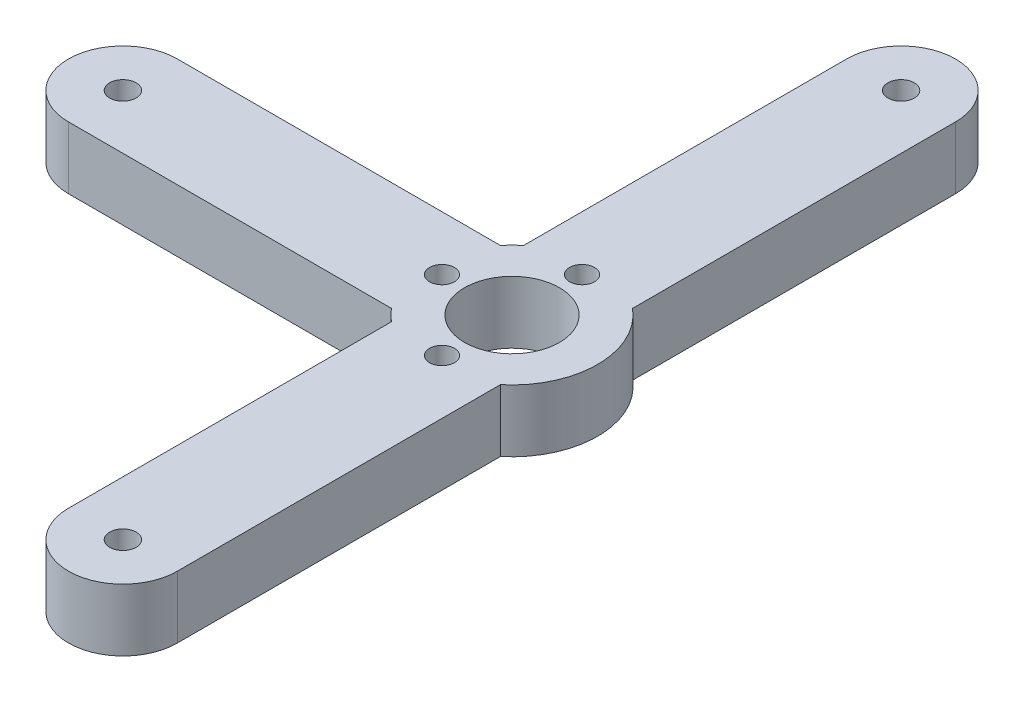
ISO-10303-21;
HEADER;
FILE_DESCRIPTION(('STEP AP214'),'2;1');
FILE_NAME('part.step','',(''),(''),'','','');
FILE_SCHEMA(('AUTOMOTIVE_DESIGN { 1 0 10303 214 1 1 1 1 }'));
ENDSEC;
DATA;
#1=APPLICATION_CONTEXT('core data for automotive mechanical design processes');
#2=APPLICATION_PROTOCOL_DEFINITION('international standard','automotive_design',2000,#1);
#3=PRODUCT_CONTEXT('',#1,'mechanical');
#4=PRODUCT('Part','Part','',(#3));
#5=PRODUCT_RELATED_PRODUCT_CATEGORY('part','',(#4));
#6=PRODUCT_DEFINITION_FORMATION('','',#4);
#7=PRODUCT_DEFINITION_CONTEXT('part definition',#1,'design');
#8=PRODUCT_DEFINITION('design','',#6,#7);
#9=PRODUCT_DEFINITION_SHAPE('','',#8);
#10=(LENGTH_UNIT() NAMED_UNIT(*) SI_UNIT(.MILLI.,.METRE.));
#11=(NAMED_UNIT(*) PLANE_ANGLE_UNIT() SI_UNIT($,.RADIAN.));
#12=(NAMED_UNIT(*) SI_UNIT($,.STERADIAN.) SOLID_ANGLE_UNIT());
#13=UNCERTAINTY_MEASURE_WITH_UNIT(LENGTH_MEASURE(1.E-05),#10,'distance_accuracy_value','');
#14=(GEOMETRIC_REPRESENTATION_CONTEXT(3) GLOBAL_UNCERTAINTY_ASSIGNED_CONTEXT((#13)) GLOBAL_UNIT_ASSIGNED_CONTEXT((#10,
#11,#12)) REPRESENTATION_CONTEXT('',''));
#15=CARTESIAN_POINT('',(0.,0.,0.));
#16=DIRECTION('',(0.,0.,1.));
#17=DIRECTION('',(1.,0.,0.));
#18=AXIS2_PLACEMENT_3D('',#15,#16,#17);
#19=CARTESIAN_POINT('',(-56.2916512459885,150.6,0.));
#20=DIRECTION('',(0.,-1.,0.));
#21=DIRECTION('',(0.,0.,-1.));
#22=AXIS2_PLACEMENT_3D('',#19,#20,#21);
#23=PLANE('',#22);
#24=CARTESIAN_POINT('',(-106.291651245989,150.6,0.));
#25=DIRECTION('',(0.,1.,0.));
#26=DIRECTION('',(0.,0.,1.));
#27=AXIS2_PLACEMENT_3D('',#24,#25,#26);
#28=CIRCLE('',#27,1.69999999999999);
#29=CARTESIAN_POINT('',(-106.291651245989,150.6,1.69999999999999));
#30=VERTEX_POINT('',#29);
#31=EDGE_CURVE('E201',#30,#30,#28,.T.);
#32=ORIENTED_EDGE('',*,*,#31,.T.);
#33=EDGE_LOOP('',(#32));
#34=FACE_BOUND('',#33,.T.);
#35=CARTESIAN_POINT('',(-106.291651245989,150.6,0.));
#36=DIRECTION('',(0.,1.,0.));
#37=DIRECTION('',(0.,0.,1.));
#38=AXIS2_PLACEMENT_3D('',#35,#36,#37);
#39=CIRCLE('',#38,3.10000000000001);
#40=CARTESIAN_POINT('',(-106.291651245989,150.6,3.10000000000001));
#41=VERTEX_POINT('',#40);
#42=EDGE_CURVE('E211',#41,#41,#39,.T.);
#43=ORIENTED_EDGE('',*,*,#42,.F.);
#44=EDGE_LOOP('',(#43));
#45=FACE_BOUND('',#44,.T.);
#46=ADVANCED_FACE('F44',(#34,#45),#23,.T.);
#47=CARTESIAN_POINT('',(-56.2916512459885,150.6,-50.));
#48=DIRECTION('',(0.,1.,0.));
#49=DIRECTION('',(0.,0.,1.));
#50=AXIS2_PLACEMENT_3D('',#47,#48,#49);
#51=CIRCLE('',#50,1.7);
#52=CARTESIAN_POINT('',(-56.2916512459885,150.6,-48.3));
#53=VERTEX_POINT('',#52);
#54=EDGE_CURVE('E199',#53,#53,#51,.T.);
#55=ORIENTED_EDGE('',*,*,#54,.T.);
#56=EDGE_LOOP('',(#55));
#57=FACE_BOUND('',#56,.T.);
#58=CARTESIAN_POINT('',(-56.2916512459885,150.6,-50.));
#59=DIRECTION('',(0.,1.,0.));
#60=DIRECTION('',(0.,0.,1.));
#61=AXIS2_PLACEMENT_3D('',#58,#59,#60);
#62=CIRCLE('',#61,3.1);
#63=CARTESIAN_POINT('',(-56.2916512459885,150.6,-46.9));
#64=VERTEX_POINT('',#63);
#65=EDGE_CURVE('E219',#64,#64,#62,.T.);
#66=ORIENTED_EDGE('',*,*,#65,.F.);
#67=EDGE_LOOP('',(#66));
#68=FACE_BOUND('',#67,.T.);
#69=ADVANCED_FACE('F331',(#57,#68),#23,.T.);
#70=CARTESIAN_POINT('',(-56.2916512459885,150.6,50.));
#71=DIRECTION('',(0.,1.,0.));
#72=DIRECTION('',(0.,0.,1.));
#73=AXIS2_PLACEMENT_3D('',#70,#71,#72);
#74=CIRCLE('',#73,1.7);
#75=CARTESIAN_POINT('',(-56.2916512459885,150.6,51.7));
#76=VERTEX_POINT('',#75);
#77=EDGE_CURVE('E197',#76,#76,#74,.T.);
#78=ORIENTED_EDGE('',*,*,#77,.T.);
#79=EDGE_LOOP('',(#78));
#80=FACE_BOUND('',#79,.T.);
#81=CARTESIAN_POINT('',(-56.2916512459885,150.6,50.));
#82=DIRECTION('',(0.,1.,0.));
#83=DIRECTION('',(0.,0.,1.));
#84=AXIS2_PLACEMENT_3D('',#81,#82,#83);
#85=CIRCLE('',#84,3.1);
#86=CARTESIAN_POINT('',(-56.2916512459885,150.6,53.1));
#87=VERTEX_POINT('',#86);
#88=EDGE_CURVE('E206',#87,#87,#85,.T.);
#89=ORIENTED_EDGE('',*,*,#88,.F.);
#90=EDGE_LOOP('',(#89));
#91=FACE_BOUND('',#90,.T.);
#92=ADVANCED_FACE('F336',(#80,#91),#23,.T.);
#93=CARTESIAN_POINT('',(-106.291651245989,153.,0.));
#94=DIRECTION('',(0.,-1.,0.));
#95=DIRECTION('',(0.,0.,-1.));
#96=AXIS2_PLACEMENT_3D('',#93,#94,#95);
#97=CYLINDRICAL_SURFACE('',#96,1.69999999999999);
#98=ORIENTED_EDGE('',*,*,#31,.F.);
#99=EDGE_LOOP('',(#98));
#100=FACE_BOUND('',#99,.T.);
#101=CARTESIAN_POINT('',(-106.291651245989,157.,0.));
#102=DIRECTION('',(0.,1.,0.));
#103=DIRECTION('',(0.,0.,1.));
#104=AXIS2_PLACEMENT_3D('',#101,#102,#103);
#105=CIRCLE('',#104,1.69999999999999);
#106=CARTESIAN_POINT('',(-106.291651245989,157.,1.69999999999999));
#107=VERTEX_POINT('',#106);
#108=EDGE_CURVE('E156',#107,#107,#105,.T.);
#109=ORIENTED_EDGE('',*,*,#108,.T.);
#110=EDGE_LOOP('',(#109));
#111=FACE_BOUND('',#110,.T.);
#112=ADVANCED_FACE('F350',(#100,#111),#97,.F.);
#113=CARTESIAN_POINT('',(-56.2916512459885,153.,-50.));
#114=DIRECTION('',(0.,-1.,0.));
#115=DIRECTION('',(0.,0.,-1.));
#116=AXIS2_PLACEMENT_3D('',#113,#114,#115);
#117=CYLINDRICAL_SURFACE('',#116,1.7);
#118=ORIENTED_EDGE('',*,*,#54,.F.);
#119=EDGE_LOOP('',(#118));
#120=FACE_BOUND('',#119,.T.);
#121=CARTESIAN_POINT('',(-56.2916512459885,157.,-50.));
#122=DIRECTION('',(0.,1.,0.));
#123=DIRECTION('',(0.,0.,1.));
#124=AXIS2_PLACEMENT_3D('',#121,#122,#123);
#125=CIRCLE('',#124,1.7);
#126=CARTESIAN_POINT('',(-56.2916512459885,157.,-48.3));
#127=VERTEX_POINT('',#126);
#128=EDGE_CURVE('E157',#127,#127,#125,.T.);
#129=ORIENTED_EDGE('',*,*,#128,.T.);
#130=EDGE_LOOP('',(#129));
#131=FACE_BOUND('',#130,.T.);
#132=ADVANCED_FACE('F355',(#120,#131),#117,.F.);
#133=CARTESIAN_POINT('',(-56.2916512459885,153.,50.));
#134=DIRECTION('',(0.,-1.,0.));
#135=DIRECTION('',(0.,0.,-1.));
#136=AXIS2_PLACEMENT_3D('',#133,#134,#135);
#137=CYLINDRICAL_SURFACE('',#136,1.7);
#138=ORIENTED_EDGE('',*,*,#77,.F.);
#139=EDGE_LOOP('',(#138));
#140=FACE_BOUND('',#139,.T.);
#141=CARTESIAN_POINT('',(-56.2916512459885,157.,50.));
#142=DIRECTION('',(0.,1.,0.));
#143=DIRECTION('',(0.,0.,1.));
#144=AXIS2_PLACEMENT_3D('',#141,#142,#143);
#145=CIRCLE('',#144,1.7);
#146=CARTESIAN_POINT('',(-56.2916512459885,157.,51.7));
#147=VERTEX_POINT('',#146);
#148=EDGE_CURVE('E434',#147,#147,#145,.T.);
#149=ORIENTED_EDGE('',*,*,#148,.T.);
#150=EDGE_LOOP('',(#149));
#151=FACE_BOUND('',#150,.T.);
#152=ADVANCED_FACE('F328',(#140,#151),#137,.F.);
#153=CARTESIAN_POINT('',(-106.291651245989,150.,0.));
#154=DIRECTION('',(0.,-1.,0.));
#155=DIRECTION('',(0.,0.,-1.));
#156=AXIS2_PLACEMENT_3D('',#153,#154,#155);
#157=CYLINDRICAL_SURFACE('',#156,3.10000000000001);
#158=CARTESIAN_POINT('',(-106.291651245989,149.,0.));
#159=DIRECTION('',(0.,1.,0.));
#160=DIRECTION('',(0.,0.,1.));
#161=AXIS2_PLACEMENT_3D('',#158,#159,#160);
#162=CIRCLE('',#161,3.10000000000001);
#163=CARTESIAN_POINT('',(-106.291651245989,149.,3.10000000000001));
#164=VERTEX_POINT('',#163);
#165=EDGE_CURVE('E227',#164,#164,#162,.T.);
#166=ORIENTED_EDGE('',*,*,#165,.F.);
#167=EDGE_LOOP('',(#166));
#168=FACE_BOUND('',#167,.T.);
#169=ORIENTED_EDGE('',*,*,#42,.T.);
#170=EDGE_LOOP('',(#169));
#171=FACE_BOUND('',#170,.T.);
#172=ADVANCED_FACE('F321',(#168,#171),#157,.F.);
#173=CARTESIAN_POINT('',(-64.776932620227,150.,7.));
#174=DIRECTION('',(0.,0.,-1.));
#175=DIRECTION('',(-1.,0.,0.));
#176=AXIS2_PLACEMENT_3D('',#173,#174,#175);
#177=PLANE('',#176);
#178=DIRECTION('',(1.,0.,0.));
#179=VECTOR('',#178,1.);
#180=CARTESIAN_POINT('',(-64.776932620227,149.,7.));
#181=LINE('',#180,#179);
#182=CARTESIAN_POINT('',(-106.291651245989,149.,7.));
#183=VERTEX_POINT('',#182);
#184=CARTESIAN_POINT('',(-64.776932620227,149.,7.));
#185=VERTEX_POINT('',#184);
#186=EDGE_CURVE('E58',#183,#185,#181,.T.);
#187=ORIENTED_EDGE('',*,*,#186,.T.);
#188=DIRECTION('',(0.,-1.,0.));
#189=VECTOR('',#188,1.);
#190=CARTESIAN_POINT('',(-64.776932620227,150.,7.));
#191=LINE('',#190,#189);
#192=CARTESIAN_POINT('',(-64.776932620227,157.,7.));
#193=VERTEX_POINT('',#192);
#194=EDGE_CURVE('E260',#193,#185,#191,.T.);
#195=ORIENTED_EDGE('',*,*,#194,.F.);
#196=DIRECTION('',(1.,0.,0.));
#197=VECTOR('',#196,1.);
#198=CARTESIAN_POINT('',(-64.776932620227,157.,7.));
#199=LINE('',#198,#197);
#200=CARTESIAN_POINT('',(-106.291651245989,157.,7.));
#201=VERTEX_POINT('',#200);
#202=EDGE_CURVE('E154',#201,#193,#199,.T.);
#203=ORIENTED_EDGE('',*,*,#202,.F.);
#204=DIRECTION('',(0.,-1.,0.));
#205=VECTOR('',#204,1.);
#206=CARTESIAN_POINT('',(-106.291651245989,150.,7.));
#207=LINE('',#206,#205);
#208=EDGE_CURVE('E259',#201,#183,#207,.T.);
#209=ORIENTED_EDGE('',*,*,#208,.T.);
#210=EDGE_LOOP('',(#187,#195,#203,#209));
#211=FACE_BOUND('',#210,.T.);
#212=ADVANCED_FACE('F317',(#211),#177,.F.);
#213=CARTESIAN_POINT('',(-106.291651245989,150.,0.));
#214=DIRECTION('',(0.,-1.,0.));
#215=DIRECTION('',(0.,0.,-1.));
#216=AXIS2_PLACEMENT_3D('',#213,#214,#215);
#217=CYLINDRICAL_SURFACE('',#216,7.);
#218=CARTESIAN_POINT('',(-106.291651245989,149.,0.));
#219=DIRECTION('',(0.,1.,0.));
#220=DIRECTION('',(0.,0.,-1.));
#221=AXIS2_PLACEMENT_3D('',#218,#219,#220);
#222=CIRCLE('',#221,7.);
#223=CARTESIAN_POINT('',(-106.291651245989,149.,-7.));
#224=VERTEX_POINT('',#223);
#225=EDGE_CURVE('E69',#224,#183,#222,.T.);
#226=ORIENTED_EDGE('',*,*,#225,.T.);
#227=ORIENTED_EDGE('',*,*,#208,.F.);
#228=CARTESIAN_POINT('',(-106.291651245989,157.,0.));
#229=DIRECTION('',(0.,1.,0.));
#230=DIRECTION('',(0.,0.,-1.));
#231=AXIS2_PLACEMENT_3D('',#228,#229,#230);
#232=CIRCLE('',#231,7.);
#233=CARTESIAN_POINT('',(-106.291651245989,157.,-7.));
#234=VERTEX_POINT('',#233);
#235=EDGE_CURVE('E183',#234,#201,#232,.T.);
#236=ORIENTED_EDGE('',*,*,#235,.F.);
#237=DIRECTION('',(0.,-1.,0.));
#238=VECTOR('',#237,1.);
#239=CARTESIAN_POINT('',(-106.291651245989,150.,-7.));
#240=LINE('',#239,#238);
#241=EDGE_CURVE('E261',#234,#224,#240,.T.);
#242=ORIENTED_EDGE('',*,*,#241,.T.);
#243=EDGE_LOOP('',(#226,#227,#236,#242));
#244=FACE_BOUND('',#243,.T.);
#245=ADVANCED_FACE('F318',(#244),#217,.T.);
#246=CARTESIAN_POINT('',(-106.291651245988,150.,-7.));
#247=DIRECTION('',(0.,0.,1.));
#248=DIRECTION('',(1.,0.,0.));
#249=AXIS2_PLACEMENT_3D('',#246,#247,#248);
#250=PLANE('',#249);
#251=DIRECTION('',(-1.,0.,0.));
#252=VECTOR('',#251,1.);
#253=CARTESIAN_POINT('',(-106.291651245988,149.,-7.));
#254=LINE('',#253,#252);
#255=CARTESIAN_POINT('',(-64.7769326202272,149.,-6.99999999999992));
#256=VERTEX_POINT('',#255);
#257=EDGE_CURVE('E251',#256,#224,#254,.T.);
#258=ORIENTED_EDGE('',*,*,#257,.T.);
#259=ORIENTED_EDGE('',*,*,#241,.F.);
#260=DIRECTION('',(-1.,0.,0.));
#261=VECTOR('',#260,1.);
#262=CARTESIAN_POINT('',(-106.291651245988,157.,-7.));
#263=LINE('',#262,#261);
#264=CARTESIAN_POINT('',(-64.7769326202272,157.,-6.99999999999992));
#265=VERTEX_POINT('',#264);
#266=EDGE_CURVE('E185',#265,#234,#263,.T.);
#267=ORIENTED_EDGE('',*,*,#266,.F.);
#268=DIRECTION('',(0.,-1.,0.));
#269=VECTOR('',#268,1.);
#270=CARTESIAN_POINT('',(-64.7769326202272,150.,-6.99999999999992));
#271=LINE('',#270,#269);
#272=EDGE_CURVE('E263',#265,#256,#271,.T.);
#273=ORIENTED_EDGE('',*,*,#272,.T.);
#274=EDGE_LOOP('',(#258,#259,#267,#273));
#275=FACE_BOUND('',#274,.T.);
#276=ADVANCED_FACE('F320',(#275),#250,.F.);
#277=CARTESIAN_POINT('',(-56.2916512459885,150.,0.));
#278=DIRECTION('',(0.,-1.,0.));
#279=DIRECTION('',(0.,0.,-1.));
#280=AXIS2_PLACEMENT_3D('',#277,#278,#279);
#281=CYLINDRICAL_SURFACE('',#280,11.);
#282=CARTESIAN_POINT('',(-56.2916512459885,149.,0.));
#283=DIRECTION('',(0.,1.,0.));
#284=DIRECTION('',(0.,0.,-1.));
#285=AXIS2_PLACEMENT_3D('',#282,#283,#284);
#286=CIRCLE('',#285,11.);
#287=CARTESIAN_POINT('',(-63.2916512459885,149.,-8.48528137423856));
#288=VERTEX_POINT('',#287);
#289=EDGE_CURVE('E253',#288,#256,#286,.T.);
#290=ORIENTED_EDGE('',*,*,#289,.T.);
#291=ORIENTED_EDGE('',*,*,#272,.F.);
#292=CARTESIAN_POINT('',(-56.2916512459885,157.,0.));
#293=DIRECTION('',(0.,1.,0.));
#294=DIRECTION('',(0.,0.,-1.));
#295=AXIS2_PLACEMENT_3D('',#292,#293,#294);
#296=CIRCLE('',#295,11.);
#297=CARTESIAN_POINT('',(-63.2916512459885,157.,-8.48528137423856));
#298=VERTEX_POINT('',#297);
#299=EDGE_CURVE('E178',#298,#265,#296,.T.);
#300=ORIENTED_EDGE('',*,*,#299,.F.);
#301=DIRECTION('',(0.,-1.,0.));
#302=VECTOR('',#301,1.);
#303=CARTESIAN_POINT('',(-63.2916512459885,150.,-8.48528137423856));
#304=LINE('',#303,#302);
#305=EDGE_CURVE('E266',#298,#288,#304,.T.);
#306=ORIENTED_EDGE('',*,*,#305,.T.);
#307=EDGE_LOOP('',(#290,#291,#300,#306));
#308=FACE_BOUND('',#307,.T.);
#309=ADVANCED_FACE('F311',(#308),#281,.T.);
#310=CARTESIAN_POINT('',(-63.2916512459885,150.,-8.48528137423857));
#311=DIRECTION('',(1.,0.,0.));
#312=DIRECTION('',(0.,0.,-1.));
#313=AXIS2_PLACEMENT_3D('',#310,#311,#312);
#314=PLANE('',#313);
#315=DIRECTION('',(0.,0.,1.));
#316=VECTOR('',#315,1.);
#317=CARTESIAN_POINT('',(-63.2916512459885,149.,-8.48528137423857));
#318=LINE('',#317,#316);
#319=CARTESIAN_POINT('',(-63.2916512459885,149.,-50.));
#320=VERTEX_POINT('',#319);
#321=EDGE_CURVE('E248',#320,#288,#318,.T.);
#322=ORIENTED_EDGE('',*,*,#321,.T.);
#323=ORIENTED_EDGE('',*,*,#305,.F.);
#324=DIRECTION('',(0.,0.,1.));
#325=VECTOR('',#324,1.);
#326=CARTESIAN_POINT('',(-63.2916512459885,157.,-8.48528137423857));
#327=LINE('',#326,#325);
#328=CARTESIAN_POINT('',(-63.2916512459885,157.,-50.));
#329=VERTEX_POINT('',#328);
#330=EDGE_CURVE('E176',#329,#298,#327,.T.);
#331=ORIENTED_EDGE('',*,*,#330,.F.);
#332=DIRECTION('',(0.,-1.,0.));
#333=VECTOR('',#332,1.);
#334=CARTESIAN_POINT('',(-63.2916512459885,150.,-50.));
#335=LINE('',#334,#333);
#336=EDGE_CURVE('E267',#329,#320,#335,.T.);
#337=ORIENTED_EDGE('',*,*,#336,.T.);
#338=EDGE_LOOP('',(#322,#323,#331,#337));
#339=FACE_BOUND('',#338,.T.);
#340=ADVANCED_FACE('F310',(#339),#314,.F.);
#341=CARTESIAN_POINT('',(-56.2916512459885,150.,-50.));
#342=DIRECTION('',(0.,-1.,0.));
#343=DIRECTION('',(0.,0.,-1.));
#344=AXIS2_PLACEMENT_3D('',#341,#342,#343);
#345=CYLINDRICAL_SURFACE('',#344,7.);
#346=CARTESIAN_POINT('',(-56.2916512459885,149.,-50.));
#347=DIRECTION('',(0.,1.,0.));
#348=DIRECTION('',(0.,0.,-1.));
#349=AXIS2_PLACEMENT_3D('',#346,#347,#348);
#350=CIRCLE('',#349,7.);
#351=CARTESIAN_POINT('',(-49.2916512459885,149.,-50.));
#352=VERTEX_POINT('',#351);
#353=EDGE_CURVE('E247',#352,#320,#350,.T.);
#354=ORIENTED_EDGE('',*,*,#353,.T.);
#355=ORIENTED_EDGE('',*,*,#336,.F.);
#356=CARTESIAN_POINT('',(-56.2916512459885,157.,-50.));
#357=DIRECTION('',(0.,1.,0.));
#358=DIRECTION('',(0.,0.,-1.));
#359=AXIS2_PLACEMENT_3D('',#356,#357,#358);
#360=CIRCLE('',#359,7.);
#361=CARTESIAN_POINT('',(-49.2916512459885,157.,-50.));
#362=VERTEX_POINT('',#361);
#363=EDGE_CURVE('E175',#362,#329,#360,.T.);
#364=ORIENTED_EDGE('',*,*,#363,.F.);
#365=DIRECTION('',(0.,-1.,0.));
#366=VECTOR('',#365,1.);
#367=CARTESIAN_POINT('',(-49.2916512459885,150.,-50.));
#368=LINE('',#367,#366);
#369=EDGE_CURVE('E275',#362,#352,#368,.T.);
#370=ORIENTED_EDGE('',*,*,#369,.T.);
#371=EDGE_LOOP('',(#354,#355,#364,#370));
#372=FACE_BOUND('',#371,.T.);
#373=ADVANCED_FACE('F303',(#372),#345,.T.);
#374=CARTESIAN_POINT('',(-49.2916512459885,150.,-50.));
#375=DIRECTION('',(-1.,0.,0.));
#376=DIRECTION('',(0.,0.,1.));
#377=AXIS2_PLACEMENT_3D('',#374,#375,#376);
#378=PLANE('',#377);
#379=DIRECTION('',(0.,0.,-1.));
#380=VECTOR('',#379,1.);
#381=CARTESIAN_POINT('',(-49.2916512459885,149.,-50.));
#382=LINE('',#381,#380);
#383=CARTESIAN_POINT('',(-49.2916512459885,149.,-8.48528137423857));
#384=VERTEX_POINT('',#383);
#385=EDGE_CURVE('E242',#384,#352,#382,.T.);
#386=ORIENTED_EDGE('',*,*,#385,.T.);
#387=ORIENTED_EDGE('',*,*,#369,.F.);
#388=DIRECTION('',(0.,0.,-1.));
#389=VECTOR('',#388,1.);
#390=CARTESIAN_POINT('',(-49.2916512459885,157.,-50.));
#391=LINE('',#390,#389);
#392=CARTESIAN_POINT('',(-49.2916512459885,157.,-8.48528137423857));
#393=VERTEX_POINT('',#392);
#394=EDGE_CURVE('E168',#393,#362,#391,.T.);
#395=ORIENTED_EDGE('',*,*,#394,.F.);
#396=DIRECTION('',(0.,-1.,0.));
#397=VECTOR('',#396,1.);
#398=CARTESIAN_POINT('',(-49.2916512459885,150.,-8.48528137423857));
#399=LINE('',#398,#397);
#400=EDGE_CURVE('E274',#393,#384,#399,.T.);
#401=ORIENTED_EDGE('',*,*,#400,.T.);
#402=EDGE_LOOP('',(#386,#387,#395,#401));
#403=FACE_BOUND('',#402,.T.);
#404=ADVANCED_FACE('F301',(#403),#378,.F.);
#405=CARTESIAN_POINT('',(-56.2916512459885,150.,0.));
#406=DIRECTION('',(0.,-1.,0.));
#407=DIRECTION('',(0.,0.,-1.));
#408=AXIS2_PLACEMENT_3D('',#405,#406,#407);
#409=CYLINDRICAL_SURFACE('',#408,11.);
#410=CARTESIAN_POINT('',(-56.2916512459885,149.,0.));
#411=DIRECTION('',(0.,1.,0.));
#412=DIRECTION('',(0.,0.,-1.));
#413=AXIS2_PLACEMENT_3D('',#410,#411,#412);
#414=CIRCLE('',#413,11.);
#415=CARTESIAN_POINT('',(-49.2916512459885,149.,8.48528137423857));
#416=VERTEX_POINT('',#415);
#417=EDGE_CURVE('E245',#416,#384,#414,.T.);
#418=ORIENTED_EDGE('',*,*,#417,.T.);
#419=ORIENTED_EDGE('',*,*,#400,.F.);
#420=CARTESIAN_POINT('',(-56.2916512459885,157.,0.));
#421=DIRECTION('',(0.,1.,0.));
#422=DIRECTION('',(0.,0.,-1.));
#423=AXIS2_PLACEMENT_3D('',#420,#421,#422);
#424=CIRCLE('',#423,11.);
#425=CARTESIAN_POINT('',(-49.2916512459885,157.,8.48528137423857));
#426=VERTEX_POINT('',#425);
#427=EDGE_CURVE('E170',#426,#393,#424,.T.);
#428=ORIENTED_EDGE('',*,*,#427,.F.);
#429=DIRECTION('',(0.,-1.,0.));
#430=VECTOR('',#429,1.);
#431=CARTESIAN_POINT('',(-49.2916512459885,150.,8.48528137423857));
#432=LINE('',#431,#430);
#433=EDGE_CURVE('E279',#426,#416,#432,.T.);
#434=ORIENTED_EDGE('',*,*,#433,.T.);
#435=EDGE_LOOP('',(#418,#419,#428,#434));
#436=FACE_BOUND('',#435,.T.);
#437=ADVANCED_FACE('F296',(#436),#409,.T.);
#438=CARTESIAN_POINT('',(-49.2916512459885,150.,8.48528137423857));
#439=DIRECTION('',(-1.,0.,0.));
#440=DIRECTION('',(0.,0.,1.));
#441=AXIS2_PLACEMENT_3D('',#438,#439,#440);
#442=PLANE('',#441);
#443=DIRECTION('',(0.,0.,-1.));
#444=VECTOR('',#443,1.);
#445=CARTESIAN_POINT('',(-49.2916512459885,149.,8.48528137423857));
#446=LINE('',#445,#444);
#447=CARTESIAN_POINT('',(-49.2916512459885,149.,50.));
#448=VERTEX_POINT('',#447);
#449=EDGE_CURVE('E244',#448,#416,#446,.T.);
#450=ORIENTED_EDGE('',*,*,#449,.T.);
#451=ORIENTED_EDGE('',*,*,#433,.F.);
#452=DIRECTION('',(0.,0.,-1.));
#453=VECTOR('',#452,1.);
#454=CARTESIAN_POINT('',(-49.2916512459885,157.,8.48528137423857));
#455=LINE('',#454,#453);
#456=CARTESIAN_POINT('',(-49.2916512459885,157.,50.));
#457=VERTEX_POINT('',#456);
#458=EDGE_CURVE('E163',#457,#426,#455,.T.);
#459=ORIENTED_EDGE('',*,*,#458,.F.);
#460=DIRECTION('',(0.,-1.,0.));
#461=VECTOR('',#460,1.);
#462=CARTESIAN_POINT('',(-49.2916512459885,150.,50.));
#463=LINE('',#462,#461);
#464=EDGE_CURVE('E284',#457,#448,#463,.T.);
#465=ORIENTED_EDGE('',*,*,#464,.T.);
#466=EDGE_LOOP('',(#450,#451,#459,#465));
#467=FACE_BOUND('',#466,.T.);
#468=ADVANCED_FACE('F291',(#467),#442,.F.);
#469=CARTESIAN_POINT('',(-56.2916512459885,150.,50.));
#470=DIRECTION('',(0.,-1.,0.));
#471=DIRECTION('',(0.,0.,-1.));
#472=AXIS2_PLACEMENT_3D('',#469,#470,#471);
#473=CYLINDRICAL_SURFACE('',#472,7.);
#474=CARTESIAN_POINT('',(-56.2916512459885,149.,50.));
#475=DIRECTION('',(0.,1.,0.));
#476=DIRECTION('',(0.,0.,-1.));
#477=AXIS2_PLACEMENT_3D('',#474,#475,#476);
#478=CIRCLE('',#477,7.);
#479=CARTESIAN_POINT('',(-63.2916512459885,149.,50.));
#480=VERTEX_POINT('',#479);
#481=EDGE_CURVE('E239',#480,#448,#478,.T.);
#482=ORIENTED_EDGE('',*,*,#481,.T.);
#483=ORIENTED_EDGE('',*,*,#464,.F.);
#484=CARTESIAN_POINT('',(-56.2916512459885,157.,50.));
#485=DIRECTION('',(0.,1.,0.));
#486=DIRECTION('',(0.,0.,-1.));
#487=AXIS2_PLACEMENT_3D('',#484,#485,#486);
#488=CIRCLE('',#487,7.);
#489=CARTESIAN_POINT('',(-63.2916512459885,157.,50.));
#490=VERTEX_POINT('',#489);
#491=EDGE_CURVE('E146',#490,#457,#488,.T.);
#492=ORIENTED_EDGE('',*,*,#491,.F.);
#493=DIRECTION('',(0.,-1.,0.));
#494=VECTOR('',#493,1.);
#495=CARTESIAN_POINT('',(-63.2916512459885,150.,50.));
#496=LINE('',#495,#494);
#497=EDGE_CURVE('E52',#490,#480,#496,.T.);
#498=ORIENTED_EDGE('',*,*,#497,.T.);
#499=EDGE_LOOP('',(#482,#483,#492,#498));
#500=FACE_BOUND('',#499,.T.);
#501=ADVANCED_FACE('F282',(#500),#473,.T.);
#502=CARTESIAN_POINT('',(-63.2916512459885,150.,50.));
#503=DIRECTION('',(1.,0.,0.));
#504=DIRECTION('',(0.,0.,-1.));
#505=AXIS2_PLACEMENT_3D('',#502,#503,#504);
#506=PLANE('',#505);
#507=DIRECTION('',(0.,0.,1.));
#508=VECTOR('',#507,1.);
#509=CARTESIAN_POINT('',(-63.2916512459885,149.,50.));
#510=LINE('',#509,#508);
#511=CARTESIAN_POINT('',(-63.2916512459881,149.,8.48528137423894));
#512=VERTEX_POINT('',#511);
#513=EDGE_CURVE('E240',#512,#480,#510,.T.);
#514=ORIENTED_EDGE('',*,*,#513,.T.);
#515=ORIENTED_EDGE('',*,*,#497,.F.);
#516=DIRECTION('',(0.,0.,1.));
#517=VECTOR('',#516,1.);
#518=CARTESIAN_POINT('',(-63.2916512459885,157.,50.));
#519=LINE('',#518,#517);
#520=CARTESIAN_POINT('',(-63.2916512459881,157.,8.48528137423894));
#521=VERTEX_POINT('',#520);
#522=EDGE_CURVE('E142',#521,#490,#519,.T.);
#523=ORIENTED_EDGE('',*,*,#522,.F.);
#524=DIRECTION('',(0.,-1.,0.));
#525=VECTOR('',#524,1.);
#526=CARTESIAN_POINT('',(-63.2916512459881,150.,8.48528137423894));
#527=LINE('',#526,#525);
#528=EDGE_CURVE('E11',#521,#512,#527,.T.);
#529=ORIENTED_EDGE('',*,*,#528,.T.);
#530=EDGE_LOOP('',(#514,#515,#523,#529));
#531=FACE_BOUND('',#530,.T.);
#532=ADVANCED_FACE('F141',(#531),#506,.F.);
#533=CARTESIAN_POINT('',(-56.2916512459885,150.,0.));
#534=DIRECTION('',(0.,-1.,0.));
#535=DIRECTION('',(0.,0.,-1.));
#536=AXIS2_PLACEMENT_3D('',#533,#534,#535);
#537=CYLINDRICAL_SURFACE('',#536,11.);
#538=CARTESIAN_POINT('',(-56.2916512459885,149.,0.));
#539=DIRECTION('',(0.,1.,0.));
#540=DIRECTION('',(0.,0.,-1.));
#541=AXIS2_PLACEMENT_3D('',#538,#539,#540);
#542=CIRCLE('',#541,11.);
#543=EDGE_CURVE('E138',#185,#512,#542,.T.);
#544=ORIENTED_EDGE('',*,*,#543,.T.);
#545=ORIENTED_EDGE('',*,*,#528,.F.);
#546=CARTESIAN_POINT('',(-56.2916512459885,157.,0.));
#547=DIRECTION('',(0.,1.,0.));
#548=DIRECTION('',(0.,0.,-1.));
#549=AXIS2_PLACEMENT_3D('',#546,#547,#548);
#550=CIRCLE('',#549,11.);
#551=EDGE_CURVE('E137',#193,#521,#550,.T.);
#552=ORIENTED_EDGE('',*,*,#551,.F.);
#553=ORIENTED_EDGE('',*,*,#194,.T.);
#554=EDGE_LOOP('',(#544,#545,#552,#553));
#555=FACE_BOUND('',#554,.T.);
#556=ADVANCED_FACE('F50',(#555),#537,.T.);
#557=CARTESIAN_POINT('',(-56.2916512459885,150.,0.));
#558=DIRECTION('',(0.,-1.,0.));
#559=DIRECTION('',(0.,0.,-1.));
#560=AXIS2_PLACEMENT_3D('',#557,#558,#559);
#561=CYLINDRICAL_SURFACE('',#560,6.1);
#562=CARTESIAN_POINT('',(-56.2916512459885,149.,0.));
#563=DIRECTION('',(0.,1.,0.));
#564=DIRECTION('',(0.,0.,1.));
#565=AXIS2_PLACEMENT_3D('',#562,#563,#564);
#566=CIRCLE('',#565,6.1);
#567=CARTESIAN_POINT('',(-56.2916512459885,149.,6.1));
#568=VERTEX_POINT('',#567);
#569=EDGE_CURVE('E234',#568,#568,#566,.T.);
#570=ORIENTED_EDGE('',*,*,#569,.F.);
#571=EDGE_LOOP('',(#570));
#572=FACE_BOUND('',#571,.T.);
#573=CARTESIAN_POINT('',(-56.2916512459885,157.,0.));
#574=DIRECTION('',(0.,1.,0.));
#575=DIRECTION('',(0.,0.,1.));
#576=AXIS2_PLACEMENT_3D('',#573,#574,#575);
#577=CIRCLE('',#576,6.1);
#578=CARTESIAN_POINT('',(-56.2916512459885,157.,6.1));
#579=VERTEX_POINT('',#578);
#580=EDGE_CURVE('E439',#579,#579,#577,.T.);
#581=ORIENTED_EDGE('',*,*,#580,.T.);
#582=EDGE_LOOP('',(#581));
#583=FACE_BOUND('',#582,.T.);
#584=ADVANCED_FACE('F377',(#572,#583),#561,.F.);
#585=CARTESIAN_POINT('',(-56.2916512459885,150.,-50.));
#586=DIRECTION('',(0.,-1.,0.));
#587=DIRECTION('',(0.,0.,-1.));
#588=AXIS2_PLACEMENT_3D('',#585,#586,#587);
#589=CYLINDRICAL_SURFACE('',#588,3.1);
#590=CARTESIAN_POINT('',(-56.2916512459885,149.,-50.));
#591=DIRECTION('',(0.,1.,0.));
#592=DIRECTION('',(0.,0.,1.));
#593=AXIS2_PLACEMENT_3D('',#590,#591,#592);
#594=CIRCLE('',#593,3.1);
#595=CARTESIAN_POINT('',(-56.2916512459885,149.,-46.9));
#596=VERTEX_POINT('',#595);
#597=EDGE_CURVE('E226',#596,#596,#594,.T.);
#598=ORIENTED_EDGE('',*,*,#597,.F.);
#599=EDGE_LOOP('',(#598));
#600=FACE_BOUND('',#599,.T.);
#601=ORIENTED_EDGE('',*,*,#65,.T.);
#602=EDGE_LOOP('',(#601));
#603=FACE_BOUND('',#602,.T.);
#604=ADVANCED_FACE('F375',(#600,#603),#589,.F.);
#605=CARTESIAN_POINT('',(-56.2916512459885,149.,0.));
#606=DIRECTION('',(0.,-1.,0.));
#607=DIRECTION('',(0.,0.,-1.));
#608=AXIS2_PLACEMENT_3D('',#605,#606,#607);
#609=PLANE('',#608);
#610=ORIENTED_EDGE('',*,*,#597,.T.);
#611=EDGE_LOOP('',(#610));
#612=FACE_BOUND('',#611,.T.);
#613=ORIENTED_EDGE('',*,*,#569,.T.);
#614=EDGE_LOOP('',(#613));
#615=FACE_BOUND('',#614,.T.);
#616=ORIENTED_EDGE('',*,*,#543,.F.);
#617=ORIENTED_EDGE('',*,*,#186,.F.);
#618=ORIENTED_EDGE('',*,*,#225,.F.);
#619=ORIENTED_EDGE('',*,*,#257,.F.);
#620=ORIENTED_EDGE('',*,*,#289,.F.);
#621=ORIENTED_EDGE('',*,*,#321,.F.);
#622=ORIENTED_EDGE('',*,*,#353,.F.);
#623=ORIENTED_EDGE('',*,*,#385,.F.);
#624=ORIENTED_EDGE('',*,*,#417,.F.);
#625=ORIENTED_EDGE('',*,*,#449,.F.);
#626=ORIENTED_EDGE('',*,*,#481,.F.);
#627=ORIENTED_EDGE('',*,*,#513,.F.);
#628=EDGE_LOOP('',(#616,#617,#618,#619,#620,#621,#622,#623,#624,#625,#626,#627));
#629=FACE_BOUND('',#628,.T.);
#630=ORIENTED_EDGE('',*,*,#165,.T.);
#631=EDGE_LOOP('',(#630));
#632=FACE_BOUND('',#631,.T.);
#633=CARTESIAN_POINT('',(-56.2916512459885,149.,50.));
#634=DIRECTION('',(0.,1.,0.));
#635=DIRECTION('',(0.,0.,1.));
#636=AXIS2_PLACEMENT_3D('',#633,#634,#635);
#637=CIRCLE('',#636,3.1);
#638=CARTESIAN_POINT('',(-56.2916512459885,149.,53.1));
#639=VERTEX_POINT('',#638);
#640=EDGE_CURVE('E220',#639,#639,#637,.T.);
#641=ORIENTED_EDGE('',*,*,#640,.T.);
#642=EDGE_LOOP('',(#641));
#643=FACE_BOUND('',#642,.T.);
#644=ADVANCED_FACE('F289',(#612,#615,#629,#632,#643),#609,.T.);
#645=CARTESIAN_POINT('',(-56.2916512459885,150.,50.));
#646=DIRECTION('',(0.,-1.,0.));
#647=DIRECTION('',(0.,0.,-1.));
#648=AXIS2_PLACEMENT_3D('',#645,#646,#647);
#649=CYLINDRICAL_SURFACE('',#648,3.1);
#650=ORIENTED_EDGE('',*,*,#640,.F.);
#651=EDGE_LOOP('',(#650));
#652=FACE_BOUND('',#651,.T.);
#653=ORIENTED_EDGE('',*,*,#88,.T.);
#654=EDGE_LOOP('',(#653));
#655=FACE_BOUND('',#654,.T.);
#656=ADVANCED_FACE('F360',(#652,#655),#649,.F.);
#657=CARTESIAN_POINT('',(-56.2916512459885,157.,0.));
#658=DIRECTION('',(0.,-1.,0.));
#659=DIRECTION('',(0.,0.,-1.));
#660=AXIS2_PLACEMENT_3D('',#657,#658,#659);
#661=PLANE('',#660);
#662=ORIENTED_EDGE('',*,*,#551,.T.);
#663=ORIENTED_EDGE('',*,*,#522,.T.);
#664=ORIENTED_EDGE('',*,*,#491,.T.);
#665=ORIENTED_EDGE('',*,*,#458,.T.);
#666=ORIENTED_EDGE('',*,*,#427,.T.);
#667=ORIENTED_EDGE('',*,*,#394,.T.);
#668=ORIENTED_EDGE('',*,*,#363,.T.);
#669=ORIENTED_EDGE('',*,*,#330,.T.);
#670=ORIENTED_EDGE('',*,*,#299,.T.);
#671=ORIENTED_EDGE('',*,*,#266,.T.);
#672=ORIENTED_EDGE('',*,*,#235,.T.);
#673=ORIENTED_EDGE('',*,*,#202,.T.);
#674=EDGE_LOOP('',(#662,#663,#664,#665,#666,#667,#668,#669,#670,#671,#672,#673));
#675=FACE_BOUND('',#674,.T.);
#676=ORIENTED_EDGE('',*,*,#108,.F.);
#677=EDGE_LOOP('',(#676));
#678=FACE_BOUND('',#677,.T.);
#679=ORIENTED_EDGE('',*,*,#128,.F.);
#680=EDGE_LOOP('',(#679));
#681=FACE_BOUND('',#680,.T.);
#682=ORIENTED_EDGE('',*,*,#580,.F.);
#683=EDGE_LOOP('',(#682));
#684=FACE_BOUND('',#683,.T.);
#685=ORIENTED_EDGE('',*,*,#148,.F.);
#686=EDGE_LOOP('',(#685));
#687=FACE_BOUND('',#686,.T.);
#688=CARTESIAN_POINT('',(-65.2916512459885,157.,0.));
#689=DIRECTION('',(0.,1.,0.));
#690=DIRECTION('',(0.,0.,1.));
#691=AXIS2_PLACEMENT_3D('',#688,#689,#690);
#692=CIRCLE('',#691,1.6);
#693=CARTESIAN_POINT('',(-65.2916512459885,157.,1.6));
#694=VERTEX_POINT('',#693);
#695=EDGE_CURVE('E435',#694,#694,#692,.T.);
#696=ORIENTED_EDGE('',*,*,#695,.F.);
#697=EDGE_LOOP('',(#696));
#698=FACE_BOUND('',#697,.T.);
#699=CARTESIAN_POINT('',(-56.2916512459885,157.,9.));
#700=DIRECTION('',(0.,1.,0.));
#701=DIRECTION('',(0.,0.,1.));
#702=AXIS2_PLACEMENT_3D('',#699,#700,#701);
#703=CIRCLE('',#702,1.6);
#704=CARTESIAN_POINT('',(-56.2916512459885,157.,10.6));
#705=VERTEX_POINT('',#704);
#706=EDGE_CURVE('E426',#705,#705,#703,.T.);
#707=ORIENTED_EDGE('',*,*,#706,.F.);
#708=EDGE_LOOP('',(#707));
#709=FACE_BOUND('',#708,.T.);
#710=CARTESIAN_POINT('',(-56.2916512459885,157.,-9.));
#711=DIRECTION('',(0.,1.,0.));
#712=DIRECTION('',(0.,0.,1.));
#713=AXIS2_PLACEMENT_3D('',#710,#711,#712);
#714=CIRCLE('',#713,1.6);
#715=CARTESIAN_POINT('',(-56.2916512459885,157.,-7.4));
#716=VERTEX_POINT('',#715);
#717=EDGE_CURVE('E419',#716,#716,#714,.T.);
#718=ORIENTED_EDGE('',*,*,#717,.F.);
#719=EDGE_LOOP('',(#718));
#720=FACE_BOUND('',#719,.T.);
#721=ADVANCED_FACE('F151',(#675,#678,#681,#684,#687,#698,#709,#720),#661,.F.);
#722=CARTESIAN_POINT('',(-65.2916512459885,157.,0.));
#723=DIRECTION('',(0.,-1.,0.));
#724=DIRECTION('',(0.,0.,-1.));
#725=AXIS2_PLACEMENT_3D('',#722,#723,#724);
#726=CYLINDRICAL_SURFACE('',#725,1.6);
#727=ORIENTED_EDGE('',*,*,#695,.T.);
#728=EDGE_LOOP('',(#727));
#729=FACE_BOUND('',#728,.T.);
#730=CARTESIAN_POINT('',(-65.2916512459885,153.,0.));
#731=DIRECTION('',(0.,1.,0.));
#732=DIRECTION('',(0.,0.,1.));
#733=AXIS2_PLACEMENT_3D('',#730,#731,#732);
#734=CIRCLE('',#733,1.6);
#735=CARTESIAN_POINT('',(-65.2916512459885,153.,1.6));
#736=VERTEX_POINT('',#735);
#737=EDGE_CURVE('E427',#736,#736,#734,.T.);
#738=ORIENTED_EDGE('',*,*,#737,.F.);
#739=EDGE_LOOP('',(#738));
#740=FACE_BOUND('',#739,.T.);
#741=ADVANCED_FACE('F369',(#729,#740),#726,.F.);
#742=CARTESIAN_POINT('',(-56.2916512459885,157.,9.));
#743=DIRECTION('',(0.,-1.,0.));
#744=DIRECTION('',(0.,0.,-1.));
#745=AXIS2_PLACEMENT_3D('',#742,#743,#744);
#746=CYLINDRICAL_SURFACE('',#745,1.6);
#747=ORIENTED_EDGE('',*,*,#706,.T.);
#748=EDGE_LOOP('',(#747));
#749=FACE_BOUND('',#748,.T.);
#750=CARTESIAN_POINT('',(-56.2916512459885,153.,9.));
#751=DIRECTION('',(0.,1.,0.));
#752=DIRECTION('',(0.,0.,1.));
#753=AXIS2_PLACEMENT_3D('',#750,#751,#752);
#754=CIRCLE('',#753,1.6);
#755=CARTESIAN_POINT('',(-56.2916512459885,153.,10.6));
#756=VERTEX_POINT('',#755);
#757=EDGE_CURVE('E421',#756,#756,#754,.T.);
#758=ORIENTED_EDGE('',*,*,#757,.F.);
#759=EDGE_LOOP('',(#758));
#760=FACE_BOUND('',#759,.T.);
#761=ADVANCED_FACE('F456',(#749,#760),#746,.F.);
#762=CARTESIAN_POINT('',(-56.2916512459885,157.,-9.));
#763=DIRECTION('',(0.,-1.,0.));
#764=DIRECTION('',(0.,0.,-1.));
#765=AXIS2_PLACEMENT_3D('',#762,#763,#764);
#766=CYLINDRICAL_SURFACE('',#765,1.6);
#767=ORIENTED_EDGE('',*,*,#717,.T.);
#768=EDGE_LOOP('',(#767));
#769=FACE_BOUND('',#768,.T.);
#770=CARTESIAN_POINT('',(-56.2916512459885,153.,-9.));
#771=DIRECTION('',(0.,1.,0.));
#772=DIRECTION('',(0.,0.,1.));
#773=AXIS2_PLACEMENT_3D('',#770,#771,#772);
#774=CIRCLE('',#773,1.6);
#775=CARTESIAN_POINT('',(-56.2916512459885,153.,-7.4));
#776=VERTEX_POINT('',#775);
#777=EDGE_CURVE('E416',#776,#776,#774,.T.);
#778=ORIENTED_EDGE('',*,*,#777,.F.);
#779=EDGE_LOOP('',(#778));
#780=FACE_BOUND('',#779,.T.);
#781=ADVANCED_FACE('F402',(#769,#780),#766,.F.);
#782=CARTESIAN_POINT('',(-56.2916512459885,150.,0.));
#783=DIRECTION('',(0.,-1.,0.));
#784=DIRECTION('',(0.,0.,-1.));
#785=AXIS2_PLACEMENT_3D('',#782,#783,#784);
#786=PLANE('',#785);
#787=CARTESIAN_POINT('',(-65.2916512459885,150.,0.));
#788=DIRECTION('',(0.,1.,0.));
#789=DIRECTION('',(0.,0.,1.));
#790=AXIS2_PLACEMENT_3D('',#787,#788,#789);
#791=CIRCLE('',#790,1.1);
#792=CARTESIAN_POINT('',(-65.2916512459885,150.,1.1));
#793=VERTEX_POINT('',#792);
#794=EDGE_CURVE('E212',#793,#793,#791,.T.);
#795=ORIENTED_EDGE('',*,*,#794,.T.);
#796=EDGE_LOOP('',(#795));
#797=FACE_BOUND('',#796,.T.);
#798=ADVANCED_FACE('F388',(#797),#786,.F.);
#799=CARTESIAN_POINT('',(-65.2916512459885,150.6,0.));
#800=DIRECTION('',(0.,-1.,0.));
#801=DIRECTION('',(0.,0.,-1.));
#802=AXIS2_PLACEMENT_3D('',#799,#800,#801);
#803=CYLINDRICAL_SURFACE('',#802,1.1);
#804=ORIENTED_EDGE('',*,*,#794,.F.);
#805=EDGE_LOOP('',(#804));
#806=FACE_BOUND('',#805,.T.);
#807=CARTESIAN_POINT('',(-65.2916512459885,153.,0.));
#808=DIRECTION('',(0.,1.,0.));
#809=DIRECTION('',(0.,0.,1.));
#810=AXIS2_PLACEMENT_3D('',#807,#808,#809);
#811=CIRCLE('',#810,1.1);
#812=CARTESIAN_POINT('',(-65.2916512459885,153.,1.1));
#813=VERTEX_POINT('',#812);
#814=EDGE_CURVE('E193',#813,#813,#811,.T.);
#815=ORIENTED_EDGE('',*,*,#814,.T.);
#816=EDGE_LOOP('',(#815));
#817=FACE_BOUND('',#816,.T.);
#818=ADVANCED_FACE('F380',(#806,#817),#803,.F.);
#819=CARTESIAN_POINT('',(-56.2916512459885,153.,0.));
#820=DIRECTION('',(0.,-1.,0.));
#821=DIRECTION('',(0.,0.,-1.));
#822=AXIS2_PLACEMENT_3D('',#819,#820,#821);
#823=PLANE('',#822);
#824=ORIENTED_EDGE('',*,*,#814,.F.);
#825=EDGE_LOOP('',(#824));
#826=FACE_BOUND('',#825,.T.);
#827=ORIENTED_EDGE('',*,*,#737,.T.);
#828=EDGE_LOOP('',(#827));
#829=FACE_BOUND('',#828,.T.);
#830=ADVANCED_FACE('F389',(#826,#829),#823,.F.);
#831=CARTESIAN_POINT('',(-56.2916512459885,150.,9.));
#832=DIRECTION('',(0.,1.,0.));
#833=DIRECTION('',(0.,0.,1.));
#834=AXIS2_PLACEMENT_3D('',#831,#832,#833);
#835=CIRCLE('',#834,1.1);
#836=CARTESIAN_POINT('',(-56.2916512459885,150.,10.1));
#837=VERTEX_POINT('',#836);
#838=EDGE_CURVE('E209',#837,#837,#835,.T.);
#839=ORIENTED_EDGE('',*,*,#838,.T.);
#840=EDGE_LOOP('',(#839));
#841=FACE_BOUND('',#840,.T.);
#842=ADVANCED_FACE('F384',(#841),#786,.F.);
#843=CARTESIAN_POINT('',(-56.2916512459885,150.6,9.));
#844=DIRECTION('',(0.,-1.,0.));
#845=DIRECTION('',(0.,0.,-1.));
#846=AXIS2_PLACEMENT_3D('',#843,#844,#845);
#847=CYLINDRICAL_SURFACE('',#846,1.1);
#848=ORIENTED_EDGE('',*,*,#838,.F.);
#849=EDGE_LOOP('',(#848));
#850=FACE_BOUND('',#849,.T.);
#851=CARTESIAN_POINT('',(-56.2916512459885,153.,9.));
#852=DIRECTION('',(0.,1.,0.));
#853=DIRECTION('',(0.,0.,1.));
#854=AXIS2_PLACEMENT_3D('',#851,#852,#853);
#855=CIRCLE('',#854,1.1);
#856=CARTESIAN_POINT('',(-56.2916512459885,153.,10.1));
#857=VERTEX_POINT('',#856);
#858=EDGE_CURVE('E191',#857,#857,#855,.T.);
#859=ORIENTED_EDGE('',*,*,#858,.T.);
#860=EDGE_LOOP('',(#859));
#861=FACE_BOUND('',#860,.T.);
#862=ADVANCED_FACE('F390',(#850,#861),#847,.F.);
#863=ORIENTED_EDGE('',*,*,#858,.F.);
#864=EDGE_LOOP('',(#863));
#865=FACE_BOUND('',#864,.T.);
#866=ORIENTED_EDGE('',*,*,#757,.T.);
#867=EDGE_LOOP('',(#866));
#868=FACE_BOUND('',#867,.T.);
#869=ADVANCED_FACE('F396',(#865,#868),#823,.F.);
#870=CARTESIAN_POINT('',(-56.2916512459885,150.,-9.));
#871=DIRECTION('',(0.,1.,0.));
#872=DIRECTION('',(0.,0.,1.));
#873=AXIS2_PLACEMENT_3D('',#870,#871,#872);
#874=CIRCLE('',#873,1.1);
#875=CARTESIAN_POINT('',(-56.2916512459885,150.,-7.9));
#876=VERTEX_POINT('',#875);
#877=EDGE_CURVE('E210',#876,#876,#874,.T.);
#878=ORIENTED_EDGE('',*,*,#877,.T.);
#879=EDGE_LOOP('',(#878));
#880=FACE_BOUND('',#879,.T.);
#881=ADVANCED_FACE('F394',(#880),#786,.F.);
#882=CARTESIAN_POINT('',(-56.2916512459885,150.6,-9.));
#883=DIRECTION('',(0.,-1.,0.));
#884=DIRECTION('',(0.,0.,-1.));
#885=AXIS2_PLACEMENT_3D('',#882,#883,#884);
#886=CYLINDRICAL_SURFACE('',#885,1.1);
#887=ORIENTED_EDGE('',*,*,#877,.F.);
#888=EDGE_LOOP('',(#887));
#889=FACE_BOUND('',#888,.T.);
#890=CARTESIAN_POINT('',(-56.2916512459885,153.,-9.));
#891=DIRECTION('',(0.,1.,0.));
#892=DIRECTION('',(0.,0.,1.));
#893=AXIS2_PLACEMENT_3D('',#890,#891,#892);
#894=CIRCLE('',#893,1.1);
#895=CARTESIAN_POINT('',(-56.2916512459885,153.,-7.9));
#896=VERTEX_POINT('',#895);
#897=EDGE_CURVE('E190',#896,#896,#894,.T.);
#898=ORIENTED_EDGE('',*,*,#897,.T.);
#899=EDGE_LOOP('',(#898));
#900=FACE_BOUND('',#899,.T.);
#901=ADVANCED_FACE('F401',(#889,#900),#886,.F.);
#902=ORIENTED_EDGE('',*,*,#897,.F.);
#903=EDGE_LOOP('',(#902));
#904=FACE_BOUND('',#903,.T.);
#905=ORIENTED_EDGE('',*,*,#777,.T.);
#906=EDGE_LOOP('',(#905));
#907=FACE_BOUND('',#906,.T.);
#908=ADVANCED_FACE('F400',(#904,#907),#823,.F.);
#909=CLOSED_SHELL('',(#46,#69,#92,#112,#132,#152,#172,#212,#245,#276,#309,#340,#373,#404,#437,
#468,#501,#532,#556,#584,#604,#644,#656,#721,#741,#761,#781,#798,#818,#830,#842,#862,#869,#881,
#901,#908));
#910=MANIFOLD_SOLID_BREP('B2',#909);
#911=ADVANCED_BREP_SHAPE_REPRESENTATION('',(#18,#910),#14);
#912=SHAPE_DEFINITION_REPRESENTATION(#9,#911);
ENDSEC;
END-ISO-10303-21;
